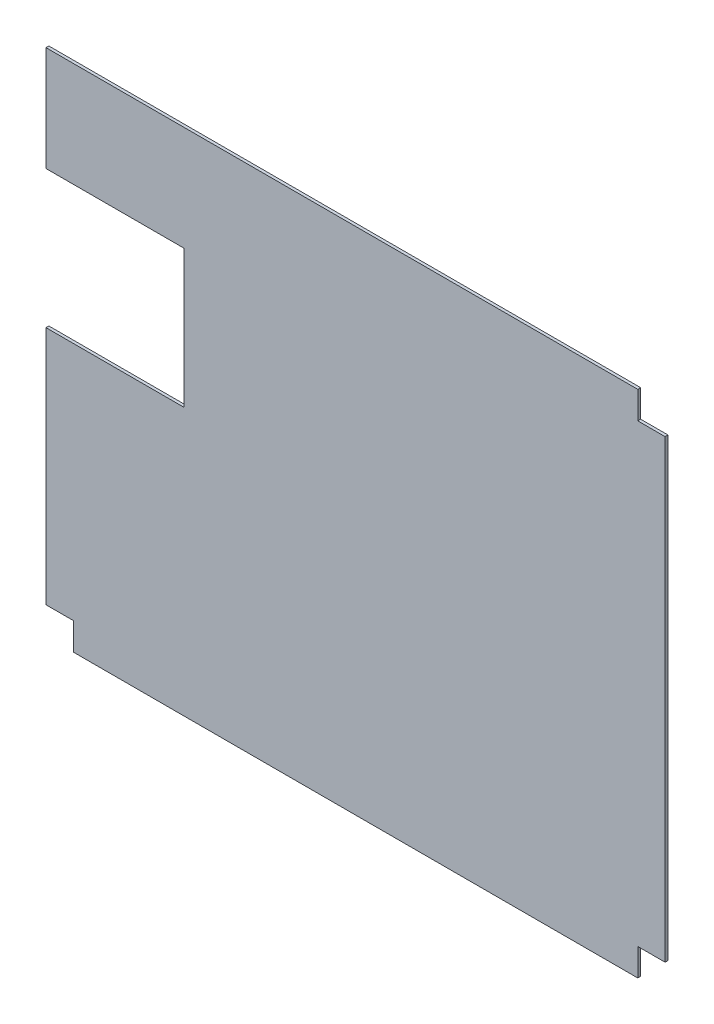
ISO-10303-21;
HEADER;
FILE_DESCRIPTION(('STEP AP214'),'2;1');
FILE_NAME('part.step','',(''),(''),'','','');
FILE_SCHEMA(('AUTOMOTIVE_DESIGN { 1 0 10303 214 1 1 1 1 }'));
ENDSEC;
DATA;
#1=APPLICATION_CONTEXT('core data for automotive mechanical design processes');
#2=APPLICATION_PROTOCOL_DEFINITION('international standard','automotive_design',2000,#1);
#3=PRODUCT_CONTEXT('',#1,'mechanical');
#4=PRODUCT('Part','Part','',(#3));
#5=PRODUCT_RELATED_PRODUCT_CATEGORY('part','',(#4));
#6=PRODUCT_DEFINITION_FORMATION('','',#4);
#7=PRODUCT_DEFINITION_CONTEXT('part definition',#1,'design');
#8=PRODUCT_DEFINITION('design','',#6,#7);
#9=PRODUCT_DEFINITION_SHAPE('','',#8);
#10=(LENGTH_UNIT() NAMED_UNIT(*) SI_UNIT(.MILLI.,.METRE.));
#11=(NAMED_UNIT(*) PLANE_ANGLE_UNIT() SI_UNIT($,.RADIAN.));
#12=(NAMED_UNIT(*) SI_UNIT($,.STERADIAN.) SOLID_ANGLE_UNIT());
#13=UNCERTAINTY_MEASURE_WITH_UNIT(LENGTH_MEASURE(1.E-05),#10,'distance_accuracy_value','');
#14=(GEOMETRIC_REPRESENTATION_CONTEXT(3) GLOBAL_UNCERTAINTY_ASSIGNED_CONTEXT((#13)) GLOBAL_UNIT_ASSIGNED_CONTEXT((#10,
#11,#12)) REPRESENTATION_CONTEXT('',''));
#15=CARTESIAN_POINT('',(0.,0.,0.));
#16=DIRECTION('',(0.,0.,1.));
#17=DIRECTION('',(1.,0.,0.));
#18=AXIS2_PLACEMENT_3D('',#15,#16,#17);
#19=CARTESIAN_POINT('',(-205.770387243736,310.6,3.175));
#20=DIRECTION('',(1.,0.,0.));
#21=DIRECTION('',(0.,1.,0.));
#22=AXIS2_PLACEMENT_3D('',#19,#20,#21);
#23=PLANE('',#22);
#24=DIRECTION('',(0.,-1.,0.));
#25=VECTOR('',#24,1.);
#26=CARTESIAN_POINT('',(-205.770387243736,310.6,3.175));
#27=LINE('',#26,#25);
#28=CARTESIAN_POINT('',(-205.770387243736,189.25,3.175));
#29=VERTEX_POINT('',#28);
#30=CARTESIAN_POINT('',(-205.770387243736,-74.4000000000001,3.175));
#31=VERTEX_POINT('',#30);
#32=EDGE_CURVE('E113',#29,#31,#27,.T.);
#33=ORIENTED_EDGE('',*,*,#32,.F.);
#34=DIRECTION('',(0.,0.,1.));
#35=VECTOR('',#34,1.);
#36=CARTESIAN_POINT('',(-205.770387243736,189.25,-6.825));
#37=LINE('',#36,#35);
#38=CARTESIAN_POINT('',(-205.770387243736,189.25,0.));
#39=VERTEX_POINT('',#38);
#40=EDGE_CURVE('E226',#39,#29,#37,.T.);
#41=ORIENTED_EDGE('',*,*,#40,.F.);
#42=DIRECTION('',(0.,-1.,0.));
#43=VECTOR('',#42,1.);
#44=CARTESIAN_POINT('',(-205.770387243736,310.6,0.));
#45=LINE('',#44,#43);
#46=CARTESIAN_POINT('',(-205.770387243736,-74.4000000000001,0.));
#47=VERTEX_POINT('',#46);
#48=EDGE_CURVE('E168',#39,#47,#45,.T.);
#49=ORIENTED_EDGE('',*,*,#48,.T.);
#50=DIRECTION('',(0.,0.,-1.));
#51=VECTOR('',#50,1.);
#52=CARTESIAN_POINT('',(-205.770387243736,-74.4000000000001,3.175));
#53=LINE('',#52,#51);
#54=EDGE_CURVE('E213',#31,#47,#53,.T.);
#55=ORIENTED_EDGE('',*,*,#54,.F.);
#56=EDGE_LOOP('',(#33,#41,#49,#55));
#57=FACE_BOUND('',#56,.T.);
#58=ADVANCED_FACE('F40',(#57),#23,.F.);
#59=CARTESIAN_POINT('',(-205.770387243736,-74.4000000000001,3.175));
#60=DIRECTION('',(0.,1.,0.));
#61=DIRECTION('',(0.,0.,1.));
#62=AXIS2_PLACEMENT_3D('',#59,#60,#61);
#63=PLANE('',#62);
#64=DIRECTION('',(1.,0.,0.));
#65=VECTOR('',#64,1.);
#66=CARTESIAN_POINT('',(-205.770387243736,-74.4000000000001,0.));
#67=LINE('',#66,#65);
#68=CARTESIAN_POINT('',(-175.770387243736,-74.4000000000001,0.));
#69=VERTEX_POINT('',#68);
#70=EDGE_CURVE('E170',#47,#69,#67,.T.);
#71=ORIENTED_EDGE('',*,*,#70,.T.);
#72=DIRECTION('',(0.,0.,-1.));
#73=VECTOR('',#72,1.);
#74=CARTESIAN_POINT('',(-175.770387243736,-74.4000000000001,3.175));
#75=LINE('',#74,#73);
#76=CARTESIAN_POINT('',(-175.770387243736,-74.4000000000001,3.175));
#77=VERTEX_POINT('',#76);
#78=EDGE_CURVE('E210',#77,#69,#75,.T.);
#79=ORIENTED_EDGE('',*,*,#78,.F.);
#80=DIRECTION('',(1.,0.,0.));
#81=VECTOR('',#80,1.);
#82=CARTESIAN_POINT('',(-205.770387243736,-74.4000000000001,3.175));
#83=LINE('',#82,#81);
#84=EDGE_CURVE('E238',#31,#77,#83,.T.);
#85=ORIENTED_EDGE('',*,*,#84,.F.);
#86=ORIENTED_EDGE('',*,*,#54,.T.);
#87=EDGE_LOOP('',(#71,#79,#85,#86));
#88=FACE_BOUND('',#87,.T.);
#89=ADVANCED_FACE('F282',(#88),#63,.F.);
#90=CARTESIAN_POINT('',(-175.770387243736,-74.4000000000001,3.175));
#91=DIRECTION('',(1.,0.,0.));
#92=DIRECTION('',(0.,0.,-1.));
#93=AXIS2_PLACEMENT_3D('',#90,#91,#92);
#94=PLANE('',#93);
#95=DIRECTION('',(0.,-1.,0.));
#96=VECTOR('',#95,1.);
#97=CARTESIAN_POINT('',(-175.770387243736,-74.4000000000001,0.));
#98=LINE('',#97,#96);
#99=CARTESIAN_POINT('',(-175.770387243736,-104.4,0.));
#100=VERTEX_POINT('',#99);
#101=EDGE_CURVE('E173',#69,#100,#98,.T.);
#102=ORIENTED_EDGE('',*,*,#101,.T.);
#103=DIRECTION('',(0.,0.,-1.));
#104=VECTOR('',#103,1.);
#105=CARTESIAN_POINT('',(-175.770387243736,-104.4,3.175));
#106=LINE('',#105,#104);
#107=CARTESIAN_POINT('',(-175.770387243736,-104.4,3.175));
#108=VERTEX_POINT('',#107);
#109=EDGE_CURVE('E207',#108,#100,#106,.T.);
#110=ORIENTED_EDGE('',*,*,#109,.F.);
#111=DIRECTION('',(0.,-1.,0.));
#112=VECTOR('',#111,1.);
#113=CARTESIAN_POINT('',(-175.770387243736,-74.4000000000001,3.175));
#114=LINE('',#113,#112);
#115=EDGE_CURVE('E240',#77,#108,#114,.T.);
#116=ORIENTED_EDGE('',*,*,#115,.F.);
#117=ORIENTED_EDGE('',*,*,#78,.T.);
#118=EDGE_LOOP('',(#102,#110,#116,#117));
#119=FACE_BOUND('',#118,.T.);
#120=ADVANCED_FACE('F286',(#119),#94,.F.);
#121=CARTESIAN_POINT('',(-175.770387243736,-104.4,3.175));
#122=DIRECTION('',(0.,1.,0.));
#123=DIRECTION('',(-1.,0.,0.));
#124=AXIS2_PLACEMENT_3D('',#121,#122,#123);
#125=PLANE('',#124);
#126=DIRECTION('',(1.,0.,0.));
#127=VECTOR('',#126,1.);
#128=CARTESIAN_POINT('',(-175.770387243736,-104.4,0.));
#129=LINE('',#128,#127);
#130=CARTESIAN_POINT('',(444.229612756264,-104.4,0.));
#131=VERTEX_POINT('',#130);
#132=EDGE_CURVE('E175',#100,#131,#129,.T.);
#133=ORIENTED_EDGE('',*,*,#132,.T.);
#134=DIRECTION('',(0.,0.,-1.));
#135=VECTOR('',#134,1.);
#136=CARTESIAN_POINT('',(444.229612756264,-104.4,3.175));
#137=LINE('',#136,#135);
#138=CARTESIAN_POINT('',(444.229612756264,-104.4,3.175));
#139=VERTEX_POINT('',#138);
#140=EDGE_CURVE('E204',#139,#131,#137,.T.);
#141=ORIENTED_EDGE('',*,*,#140,.F.);
#142=DIRECTION('',(1.,0.,0.));
#143=VECTOR('',#142,1.);
#144=CARTESIAN_POINT('',(-175.770387243736,-104.4,3.175));
#145=LINE('',#144,#143);
#146=EDGE_CURVE('E242',#108,#139,#145,.T.);
#147=ORIENTED_EDGE('',*,*,#146,.F.);
#148=ORIENTED_EDGE('',*,*,#109,.T.);
#149=EDGE_LOOP('',(#133,#141,#147,#148));
#150=FACE_BOUND('',#149,.T.);
#151=ADVANCED_FACE('F291',(#150),#125,.F.);
#152=CARTESIAN_POINT('',(444.229612756264,-104.4,3.175));
#153=DIRECTION('',(-1.,0.,0.));
#154=DIRECTION('',(0.,0.,1.));
#155=AXIS2_PLACEMENT_3D('',#152,#153,#154);
#156=PLANE('',#155);
#157=DIRECTION('',(0.,1.,0.));
#158=VECTOR('',#157,1.);
#159=CARTESIAN_POINT('',(444.229612756264,-104.4,0.));
#160=LINE('',#159,#158);
#161=CARTESIAN_POINT('',(444.229612756264,-74.4000000000001,0.));
#162=VERTEX_POINT('',#161);
#163=EDGE_CURVE('E177',#131,#162,#160,.T.);
#164=ORIENTED_EDGE('',*,*,#163,.T.);
#165=DIRECTION('',(0.,0.,-1.));
#166=VECTOR('',#165,1.);
#167=CARTESIAN_POINT('',(444.229612756264,-74.4000000000001,3.175));
#168=LINE('',#167,#166);
#169=CARTESIAN_POINT('',(444.229612756264,-74.4000000000001,3.175));
#170=VERTEX_POINT('',#169);
#171=EDGE_CURVE('E201',#170,#162,#168,.T.);
#172=ORIENTED_EDGE('',*,*,#171,.F.);
#173=DIRECTION('',(0.,1.,0.));
#174=VECTOR('',#173,1.);
#175=CARTESIAN_POINT('',(444.229612756264,-104.4,3.175));
#176=LINE('',#175,#174);
#177=EDGE_CURVE('E244',#139,#170,#176,.T.);
#178=ORIENTED_EDGE('',*,*,#177,.F.);
#179=ORIENTED_EDGE('',*,*,#140,.T.);
#180=EDGE_LOOP('',(#164,#172,#178,#179));
#181=FACE_BOUND('',#180,.T.);
#182=ADVANCED_FACE('F297',(#181),#156,.F.);
#183=CARTESIAN_POINT('',(444.229612756264,-74.4000000000001,3.175));
#184=DIRECTION('',(0.,1.,0.));
#185=DIRECTION('',(0.,0.,1.));
#186=AXIS2_PLACEMENT_3D('',#183,#184,#185);
#187=PLANE('',#186);
#188=DIRECTION('',(1.,0.,0.));
#189=VECTOR('',#188,1.);
#190=CARTESIAN_POINT('',(444.229612756264,-74.4000000000001,0.));
#191=LINE('',#190,#189);
#192=CARTESIAN_POINT('',(474.229612756264,-74.4000000000001,0.));
#193=VERTEX_POINT('',#192);
#194=EDGE_CURVE('E179',#162,#193,#191,.T.);
#195=ORIENTED_EDGE('',*,*,#194,.T.);
#196=DIRECTION('',(0.,0.,-1.));
#197=VECTOR('',#196,1.);
#198=CARTESIAN_POINT('',(474.229612756264,-74.4000000000001,3.175));
#199=LINE('',#198,#197);
#200=CARTESIAN_POINT('',(474.229612756264,-74.4000000000001,3.175));
#201=VERTEX_POINT('',#200);
#202=EDGE_CURVE('E198',#201,#193,#199,.T.);
#203=ORIENTED_EDGE('',*,*,#202,.F.);
#204=DIRECTION('',(1.,0.,0.));
#205=VECTOR('',#204,1.);
#206=CARTESIAN_POINT('',(444.229612756264,-74.4000000000001,3.175));
#207=LINE('',#206,#205);
#208=EDGE_CURVE('E246',#170,#201,#207,.T.);
#209=ORIENTED_EDGE('',*,*,#208,.F.);
#210=ORIENTED_EDGE('',*,*,#171,.T.);
#211=EDGE_LOOP('',(#195,#203,#209,#210));
#212=FACE_BOUND('',#211,.T.);
#213=ADVANCED_FACE('F301',(#212),#187,.F.);
#214=CARTESIAN_POINT('',(474.229612756264,-74.4000000000001,3.175));
#215=DIRECTION('',(-1.,0.,0.));
#216=DIRECTION('',(0.,0.,1.));
#217=AXIS2_PLACEMENT_3D('',#214,#215,#216);
#218=PLANE('',#217);
#219=DIRECTION('',(0.,1.,0.));
#220=VECTOR('',#219,1.);
#221=CARTESIAN_POINT('',(474.229612756264,-74.4000000000001,0.));
#222=LINE('',#221,#220);
#223=CARTESIAN_POINT('',(474.229612756264,425.6,0.));
#224=VERTEX_POINT('',#223);
#225=EDGE_CURVE('E181',#193,#224,#222,.T.);
#226=ORIENTED_EDGE('',*,*,#225,.T.);
#227=DIRECTION('',(0.,0.,-1.));
#228=VECTOR('',#227,1.);
#229=CARTESIAN_POINT('',(474.229612756264,425.6,3.175));
#230=LINE('',#229,#228);
#231=CARTESIAN_POINT('',(474.229612756264,425.6,3.175));
#232=VERTEX_POINT('',#231);
#233=EDGE_CURVE('E195',#232,#224,#230,.T.);
#234=ORIENTED_EDGE('',*,*,#233,.F.);
#235=DIRECTION('',(0.,1.,0.));
#236=VECTOR('',#235,1.);
#237=CARTESIAN_POINT('',(474.229612756264,-74.4000000000001,3.175));
#238=LINE('',#237,#236);
#239=EDGE_CURVE('E248',#201,#232,#238,.T.);
#240=ORIENTED_EDGE('',*,*,#239,.F.);
#241=ORIENTED_EDGE('',*,*,#202,.T.);
#242=EDGE_LOOP('',(#226,#234,#240,#241));
#243=FACE_BOUND('',#242,.T.);
#244=ADVANCED_FACE('F254',(#243),#218,.F.);
#245=CARTESIAN_POINT('',(474.229612756264,425.6,3.175));
#246=DIRECTION('',(0.,-1.,0.));
#247=DIRECTION('',(0.,0.,-1.));
#248=AXIS2_PLACEMENT_3D('',#245,#246,#247);
#249=PLANE('',#248);
#250=DIRECTION('',(-1.,0.,0.));
#251=VECTOR('',#250,1.);
#252=CARTESIAN_POINT('',(474.229612756264,425.6,0.));
#253=LINE('',#252,#251);
#254=CARTESIAN_POINT('',(444.229612756264,425.6,0.));
#255=VERTEX_POINT('',#254);
#256=EDGE_CURVE('E183',#224,#255,#253,.T.);
#257=ORIENTED_EDGE('',*,*,#256,.T.);
#258=DIRECTION('',(0.,0.,-1.));
#259=VECTOR('',#258,1.);
#260=CARTESIAN_POINT('',(444.229612756264,425.6,3.175));
#261=LINE('',#260,#259);
#262=CARTESIAN_POINT('',(444.229612756264,425.6,3.175));
#263=VERTEX_POINT('',#262);
#264=EDGE_CURVE('E157',#263,#255,#261,.T.);
#265=ORIENTED_EDGE('',*,*,#264,.F.);
#266=DIRECTION('',(-1.,0.,0.));
#267=VECTOR('',#266,1.);
#268=CARTESIAN_POINT('',(474.229612756264,425.6,3.175));
#269=LINE('',#268,#267);
#270=EDGE_CURVE('E145',#232,#263,#269,.T.);
#271=ORIENTED_EDGE('',*,*,#270,.F.);
#272=ORIENTED_EDGE('',*,*,#233,.T.);
#273=EDGE_LOOP('',(#257,#265,#271,#272));
#274=FACE_BOUND('',#273,.T.);
#275=ADVANCED_FACE('F258',(#274),#249,.F.);
#276=CARTESIAN_POINT('',(444.229612756264,425.6,3.175));
#277=DIRECTION('',(-1.,0.,0.));
#278=DIRECTION('',(0.,0.,1.));
#279=AXIS2_PLACEMENT_3D('',#276,#277,#278);
#280=PLANE('',#279);
#281=DIRECTION('',(0.,1.,0.));
#282=VECTOR('',#281,1.);
#283=CARTESIAN_POINT('',(444.229612756264,425.6,0.));
#284=LINE('',#283,#282);
#285=CARTESIAN_POINT('',(444.229612756264,455.6,0.));
#286=VERTEX_POINT('',#285);
#287=EDGE_CURVE('E154',#255,#286,#284,.T.);
#288=ORIENTED_EDGE('',*,*,#287,.T.);
#289=DIRECTION('',(0.,0.,-1.));
#290=VECTOR('',#289,1.);
#291=CARTESIAN_POINT('',(444.229612756264,455.6,3.175));
#292=LINE('',#291,#290);
#293=CARTESIAN_POINT('',(444.229612756264,455.6,3.175));
#294=VERTEX_POINT('',#293);
#295=EDGE_CURVE('E151',#294,#286,#292,.T.);
#296=ORIENTED_EDGE('',*,*,#295,.F.);
#297=DIRECTION('',(0.,1.,0.));
#298=VECTOR('',#297,1.);
#299=CARTESIAN_POINT('',(444.229612756264,425.6,3.175));
#300=LINE('',#299,#298);
#301=EDGE_CURVE('E138',#263,#294,#300,.T.);
#302=ORIENTED_EDGE('',*,*,#301,.F.);
#303=ORIENTED_EDGE('',*,*,#264,.T.);
#304=EDGE_LOOP('',(#288,#296,#302,#303));
#305=FACE_BOUND('',#304,.T.);
#306=ADVANCED_FACE('F152',(#305),#280,.F.);
#307=CARTESIAN_POINT('',(444.229612756264,455.6,3.175));
#308=DIRECTION('',(0.,-1.,0.));
#309=DIRECTION('',(1.,0.,0.));
#310=AXIS2_PLACEMENT_3D('',#307,#308,#309);
#311=PLANE('',#310);
#312=DIRECTION('',(-1.,0.,0.));
#313=VECTOR('',#312,1.);
#314=CARTESIAN_POINT('',(444.229612756264,455.6,0.));
#315=LINE('',#314,#313);
#316=CARTESIAN_POINT('',(-205.770387243736,455.6,0.));
#317=VERTEX_POINT('',#316);
#318=EDGE_CURVE('E186',#286,#317,#315,.T.);
#319=ORIENTED_EDGE('',*,*,#318,.T.);
#320=DIRECTION('',(0.,0.,-1.));
#321=VECTOR('',#320,1.);
#322=CARTESIAN_POINT('',(-205.770387243736,455.6,3.175));
#323=LINE('',#322,#321);
#324=CARTESIAN_POINT('',(-205.770387243736,455.6,3.175));
#325=VERTEX_POINT('',#324);
#326=EDGE_CURVE('E158',#325,#317,#323,.T.);
#327=ORIENTED_EDGE('',*,*,#326,.F.);
#328=DIRECTION('',(-1.,0.,0.));
#329=VECTOR('',#328,1.);
#330=CARTESIAN_POINT('',(444.229612756264,455.6,3.175));
#331=LINE('',#330,#329);
#332=EDGE_CURVE('E142',#294,#325,#331,.T.);
#333=ORIENTED_EDGE('',*,*,#332,.F.);
#334=ORIENTED_EDGE('',*,*,#295,.T.);
#335=EDGE_LOOP('',(#319,#327,#333,#334));
#336=FACE_BOUND('',#335,.T.);
#337=ADVANCED_FACE('F160',(#336),#311,.F.);
#338=CARTESIAN_POINT('',(-205.770387243736,340.6,3.175));
#339=DIRECTION('',(1.,0.,0.));
#340=DIRECTION('',(0.,0.,-1.));
#341=AXIS2_PLACEMENT_3D('',#338,#339,#340);
#342=PLANE('',#341);
#343=DIRECTION('',(0.,-1.,0.));
#344=VECTOR('',#343,1.);
#345=CARTESIAN_POINT('',(-205.770387243736,340.6,0.));
#346=LINE('',#345,#344);
#347=CARTESIAN_POINT('',(-205.770387243736,340.6,0.));
#348=VERTEX_POINT('',#347);
#349=EDGE_CURVE('E105',#317,#348,#346,.T.);
#350=ORIENTED_EDGE('',*,*,#349,.T.);
#351=DIRECTION('',(0.,0.,-1.));
#352=VECTOR('',#351,1.);
#353=CARTESIAN_POINT('',(-205.770387243736,340.6,3.175));
#354=LINE('',#353,#352);
#355=CARTESIAN_POINT('',(-205.770387243736,340.6,3.175));
#356=VERTEX_POINT('',#355);
#357=EDGE_CURVE('E167',#356,#348,#354,.T.);
#358=ORIENTED_EDGE('',*,*,#357,.F.);
#359=DIRECTION('',(0.,-1.,0.));
#360=VECTOR('',#359,1.);
#361=CARTESIAN_POINT('',(-205.770387243736,340.6,3.175));
#362=LINE('',#361,#360);
#363=EDGE_CURVE('E63',#325,#356,#362,.T.);
#364=ORIENTED_EDGE('',*,*,#363,.F.);
#365=ORIENTED_EDGE('',*,*,#326,.T.);
#366=EDGE_LOOP('',(#350,#358,#364,#365));
#367=FACE_BOUND('',#366,.T.);
#368=ADVANCED_FACE('F259',(#367),#342,.F.);
#369=CARTESIAN_POINT('',(-175.770387243736,340.6,3.175));
#370=DIRECTION('',(0.,1.,0.));
#371=DIRECTION('',(-1.,0.,0.));
#372=AXIS2_PLACEMENT_3D('',#369,#370,#371);
#373=PLANE('',#372);
#374=DIRECTION('',(1.,0.,0.));
#375=VECTOR('',#374,1.);
#376=CARTESIAN_POINT('',(-175.770387243736,340.6,0.));
#377=LINE('',#376,#375);
#378=CARTESIAN_POINT('',(-54.4203872437357,340.6,0.));
#379=VERTEX_POINT('',#378);
#380=EDGE_CURVE('E189',#348,#379,#377,.T.);
#381=ORIENTED_EDGE('',*,*,#380,.T.);
#382=DIRECTION('',(0.,0.,1.));
#383=VECTOR('',#382,1.);
#384=CARTESIAN_POINT('',(-54.4203872437357,340.6,-6.825));
#385=LINE('',#384,#383);
#386=CARTESIAN_POINT('',(-54.4203872437357,340.6,3.175));
#387=VERTEX_POINT('',#386);
#388=EDGE_CURVE('E171',#379,#387,#385,.T.);
#389=ORIENTED_EDGE('',*,*,#388,.T.);
#390=DIRECTION('',(1.,0.,0.));
#391=VECTOR('',#390,1.);
#392=CARTESIAN_POINT('',(-175.770387243736,340.6,3.175));
#393=LINE('',#392,#391);
#394=EDGE_CURVE('E162',#356,#387,#393,.T.);
#395=ORIENTED_EDGE('',*,*,#394,.F.);
#396=ORIENTED_EDGE('',*,*,#357,.T.);
#397=EDGE_LOOP('',(#381,#389,#395,#396));
#398=FACE_BOUND('',#397,.T.);
#399=ADVANCED_FACE('F263',(#398),#373,.F.);
#400=CARTESIAN_POINT('',(0.,0.,3.175));
#401=DIRECTION('',(0.,0.,1.));
#402=DIRECTION('',(1.,0.,0.));
#403=AXIS2_PLACEMENT_3D('',#400,#401,#402);
#404=PLANE('',#403);
#405=ORIENTED_EDGE('',*,*,#394,.T.);
#406=DIRECTION('',(0.,1.,0.));
#407=VECTOR('',#406,1.);
#408=CARTESIAN_POINT('',(-54.4203872437357,340.6,3.175));
#409=LINE('',#408,#407);
#410=CARTESIAN_POINT('',(-54.4203872437357,189.25,3.175));
#411=VERTEX_POINT('',#410);
#412=EDGE_CURVE('E229',#411,#387,#409,.T.);
#413=ORIENTED_EDGE('',*,*,#412,.F.);
#414=DIRECTION('',(1.,0.,0.));
#415=VECTOR('',#414,1.);
#416=CARTESIAN_POINT('',(-54.4203872437357,189.25,3.175));
#417=LINE('',#416,#415);
#418=EDGE_CURVE('E233',#29,#411,#417,.T.);
#419=ORIENTED_EDGE('',*,*,#418,.F.);
#420=ORIENTED_EDGE('',*,*,#32,.T.);
#421=ORIENTED_EDGE('',*,*,#84,.T.);
#422=ORIENTED_EDGE('',*,*,#115,.T.);
#423=ORIENTED_EDGE('',*,*,#146,.T.);
#424=ORIENTED_EDGE('',*,*,#177,.T.);
#425=ORIENTED_EDGE('',*,*,#208,.T.);
#426=ORIENTED_EDGE('',*,*,#239,.T.);
#427=ORIENTED_EDGE('',*,*,#270,.T.);
#428=ORIENTED_EDGE('',*,*,#301,.T.);
#429=ORIENTED_EDGE('',*,*,#332,.T.);
#430=ORIENTED_EDGE('',*,*,#363,.T.);
#431=EDGE_LOOP('',(#405,#413,#419,#420,#421,#422,#423,#424,#425,#426,#427,#428,#429,#430));
#432=FACE_BOUND('',#431,.T.);
#433=ADVANCED_FACE('F140',(#432),#404,.T.);
#434=CARTESIAN_POINT('',(0.,0.,0.));
#435=DIRECTION('',(0.,0.,1.));
#436=DIRECTION('',(1.,0.,0.));
#437=AXIS2_PLACEMENT_3D('',#434,#435,#436);
#438=PLANE('',#437);
#439=DIRECTION('',(0.,1.,0.));
#440=VECTOR('',#439,1.);
#441=CARTESIAN_POINT('',(-54.4203872437356,0.,0.));
#442=LINE('',#441,#440);
#443=CARTESIAN_POINT('',(-54.4203872437357,189.25,0.));
#444=VERTEX_POINT('',#443);
#445=EDGE_CURVE('E11',#444,#379,#442,.T.);
#446=ORIENTED_EDGE('',*,*,#445,.T.);
#447=ORIENTED_EDGE('',*,*,#380,.F.);
#448=ORIENTED_EDGE('',*,*,#349,.F.);
#449=ORIENTED_EDGE('',*,*,#318,.F.);
#450=ORIENTED_EDGE('',*,*,#287,.F.);
#451=ORIENTED_EDGE('',*,*,#256,.F.);
#452=ORIENTED_EDGE('',*,*,#225,.F.);
#453=ORIENTED_EDGE('',*,*,#194,.F.);
#454=ORIENTED_EDGE('',*,*,#163,.F.);
#455=ORIENTED_EDGE('',*,*,#132,.F.);
#456=ORIENTED_EDGE('',*,*,#101,.F.);
#457=ORIENTED_EDGE('',*,*,#70,.F.);
#458=ORIENTED_EDGE('',*,*,#48,.F.);
#459=DIRECTION('',(1.,0.,0.));
#460=VECTOR('',#459,1.);
#461=CARTESIAN_POINT('',(0.,189.25,0.));
#462=LINE('',#461,#460);
#463=EDGE_CURVE('E47',#39,#444,#462,.T.);
#464=ORIENTED_EDGE('',*,*,#463,.T.);
#465=EDGE_LOOP('',(#446,#447,#448,#449,#450,#451,#452,#453,#454,#455,#456,#457,#458,#464));
#466=FACE_BOUND('',#465,.T.);
#467=ADVANCED_FACE('F218',(#466),#438,.F.);
#468=CARTESIAN_POINT('',(-54.4203872437357,340.6,-6.825));
#469=DIRECTION('',(1.,0.,0.));
#470=DIRECTION('',(0.,1.,0.));
#471=AXIS2_PLACEMENT_3D('',#468,#469,#470);
#472=PLANE('',#471);
#473=DIRECTION('',(0.,0.,1.));
#474=VECTOR('',#473,1.);
#475=CARTESIAN_POINT('',(-54.4203872437357,189.25,-6.825));
#476=LINE('',#475,#474);
#477=EDGE_CURVE('E54',#444,#411,#476,.T.);
#478=ORIENTED_EDGE('',*,*,#477,.T.);
#479=ORIENTED_EDGE('',*,*,#412,.T.);
#480=ORIENTED_EDGE('',*,*,#388,.F.);
#481=ORIENTED_EDGE('',*,*,#445,.F.);
#482=EDGE_LOOP('',(#478,#479,#480,#481));
#483=FACE_BOUND('',#482,.T.);
#484=ADVANCED_FACE('F271',(#483),#472,.F.);
#485=CARTESIAN_POINT('',(-54.4203872437357,189.25,-6.825));
#486=DIRECTION('',(0.,-1.,0.));
#487=DIRECTION('',(1.,0.,0.));
#488=AXIS2_PLACEMENT_3D('',#485,#486,#487);
#489=PLANE('',#488);
#490=ORIENTED_EDGE('',*,*,#40,.T.);
#491=ORIENTED_EDGE('',*,*,#418,.T.);
#492=ORIENTED_EDGE('',*,*,#477,.F.);
#493=ORIENTED_EDGE('',*,*,#463,.F.);
#494=EDGE_LOOP('',(#490,#491,#492,#493));
#495=FACE_BOUND('',#494,.T.);
#496=ADVANCED_FACE('F224',(#495),#489,.F.);
#497=CLOSED_SHELL('',(#58,#89,#120,#151,#182,#213,#244,#275,#306,#337,#368,#399,#433,#467,#484,#496));
#498=MANIFOLD_SOLID_BREP('B2',#497);
#499=ADVANCED_BREP_SHAPE_REPRESENTATION('',(#18,#498),#14);
#500=SHAPE_DEFINITION_REPRESENTATION(#9,#499);
ENDSEC;
END-ISO-10303-21;
